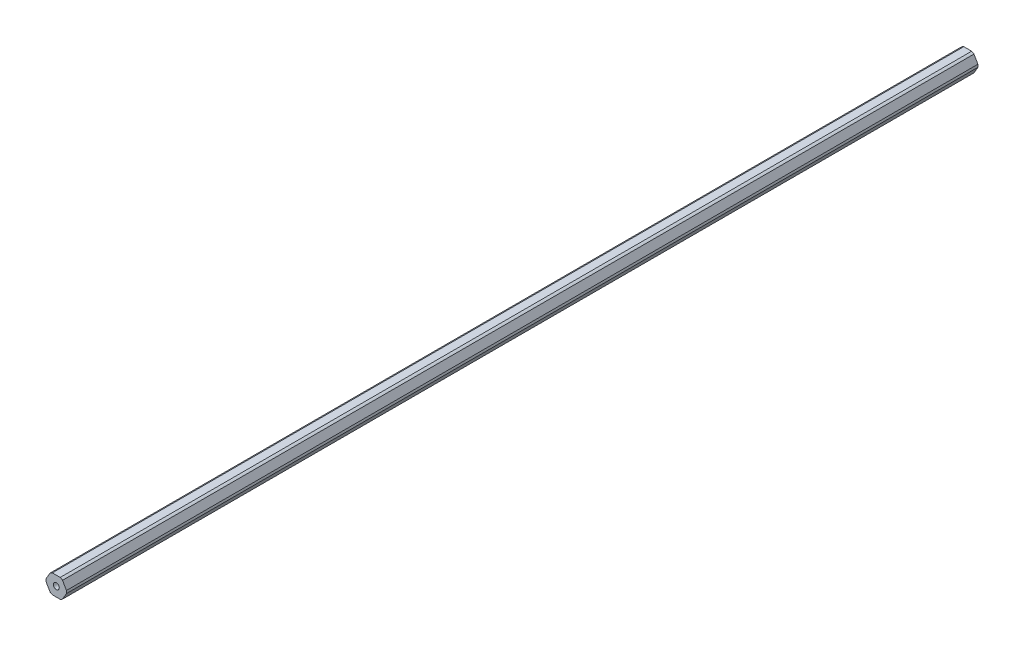
ISO-10303-21;
HEADER;
FILE_DESCRIPTION(('STEP AP214'),'2;1');
FILE_NAME('part.step','',(''),(''),'','','');
FILE_SCHEMA(('AUTOMOTIVE_DESIGN { 1 0 10303 214 1 1 1 1 }'));
ENDSEC;
DATA;
#1=APPLICATION_CONTEXT('core data for automotive mechanical design processes');
#2=APPLICATION_PROTOCOL_DEFINITION('international standard','automotive_design',2000,#1);
#3=PRODUCT_CONTEXT('',#1,'mechanical');
#4=PRODUCT('Part','Part','',(#3));
#5=PRODUCT_RELATED_PRODUCT_CATEGORY('part','',(#4));
#6=PRODUCT_DEFINITION_FORMATION('','',#4);
#7=PRODUCT_DEFINITION_CONTEXT('part definition',#1,'design');
#8=PRODUCT_DEFINITION('design','',#6,#7);
#9=PRODUCT_DEFINITION_SHAPE('','',#8);
#10=(LENGTH_UNIT() NAMED_UNIT(*) SI_UNIT(.MILLI.,.METRE.));
#11=(NAMED_UNIT(*) PLANE_ANGLE_UNIT() SI_UNIT($,.RADIAN.));
#12=(NAMED_UNIT(*) SI_UNIT($,.STERADIAN.) SOLID_ANGLE_UNIT());
#13=UNCERTAINTY_MEASURE_WITH_UNIT(LENGTH_MEASURE(1.E-05),#10,'distance_accuracy_value','');
#14=(GEOMETRIC_REPRESENTATION_CONTEXT(3) GLOBAL_UNCERTAINTY_ASSIGNED_CONTEXT((#13)) GLOBAL_UNIT_ASSIGNED_CONTEXT((#10,
#11,#12)) REPRESENTATION_CONTEXT('',''));
#15=CARTESIAN_POINT('',(0.,0.,0.));
#16=DIRECTION('',(0.,0.,1.));
#17=DIRECTION('',(1.,0.,0.));
#18=AXIS2_PLACEMENT_3D('',#15,#16,#17);
#19=CARTESIAN_POINT('',(5.49926131403119,3.175,609.6));
#20=DIRECTION('',(-0.866025403784439,-0.5,0.));
#21=DIRECTION('',(0.5,-0.866025403784438,0.));
#22=AXIS2_PLACEMENT_3D('',#19,#20,#21);
#23=PLANE('',#22);
#24=DIRECTION('',(-0.5,0.866025403784439,0.));
#25=VECTOR('',#24,1.);
#26=CARTESIAN_POINT('',(5.49926131403119,3.175,0.));
#27=LINE('',#26,#25);
#28=CARTESIAN_POINT('',(6.81675178197583,0.893039571032188,0.));
#29=VERTEX_POINT('',#28);
#30=CARTESIAN_POINT('',(4.18177084608655,5.45696042896782,0.));
#31=VERTEX_POINT('',#30);
#32=EDGE_CURVE('E166',#29,#31,#27,.T.);
#33=ORIENTED_EDGE('',*,*,#32,.T.);
#34=DIRECTION('',(0.,0.,-1.));
#35=VECTOR('',#34,1.);
#36=CARTESIAN_POINT('',(4.18177084608655,5.45696042896782,609.6));
#37=LINE('',#36,#35);
#38=CARTESIAN_POINT('',(4.18177084608655,5.45696042896782,609.6));
#39=VERTEX_POINT('',#38);
#40=EDGE_CURVE('E11',#39,#31,#37,.T.);
#41=ORIENTED_EDGE('',*,*,#40,.F.);
#42=DIRECTION('',(-0.5,0.866025403784439,0.));
#43=VECTOR('',#42,1.);
#44=CARTESIAN_POINT('',(5.49926131403119,3.175,609.6));
#45=LINE('',#44,#43);
#46=CARTESIAN_POINT('',(6.81675178197583,0.893039571032188,609.6));
#47=VERTEX_POINT('',#46);
#48=EDGE_CURVE('E225',#47,#39,#45,.T.);
#49=ORIENTED_EDGE('',*,*,#48,.F.);
#50=DIRECTION('',(0.,0.,-1.));
#51=VECTOR('',#50,1.);
#52=CARTESIAN_POINT('',(6.81675178197583,0.893039571032188,609.6));
#53=LINE('',#52,#51);
#54=EDGE_CURVE('E159',#47,#29,#53,.T.);
#55=ORIENTED_EDGE('',*,*,#54,.T.);
#56=EDGE_LOOP('',(#33,#41,#49,#55));
#57=FACE_BOUND('',#56,.T.);
#58=ADVANCED_FACE('F41',(#57),#23,.F.);
#59=CARTESIAN_POINT('',(0.,0.,609.6));
#60=DIRECTION('',(0.,0.,-1.));
#61=DIRECTION('',(-1.,0.,0.));
#62=AXIS2_PLACEMENT_3D('',#59,#60,#61);
#63=CYLINDRICAL_SURFACE('',#62,6.874999966);
#64=CARTESIAN_POINT('',(0.,0.,0.));
#65=DIRECTION('',(0.,0.,1.));
#66=DIRECTION('',(1.,0.,0.));
#67=AXIS2_PLACEMENT_3D('',#64,#65,#66);
#68=CIRCLE('',#67,6.874999966);
#69=CARTESIAN_POINT('',(2.63498093588928,6.35,0.));
#70=VERTEX_POINT('',#69);
#71=EDGE_CURVE('E169',#31,#70,#68,.T.);
#72=ORIENTED_EDGE('',*,*,#71,.T.);
#73=DIRECTION('',(0.,0.,-1.));
#74=VECTOR('',#73,1.);
#75=CARTESIAN_POINT('',(2.63498093588928,6.35,609.6));
#76=LINE('',#75,#74);
#77=CARTESIAN_POINT('',(2.63498093588928,6.35,609.6));
#78=VERTEX_POINT('',#77);
#79=EDGE_CURVE('E50',#78,#70,#76,.T.);
#80=ORIENTED_EDGE('',*,*,#79,.F.);
#81=CARTESIAN_POINT('',(0.,0.,609.6));
#82=DIRECTION('',(0.,0.,1.));
#83=DIRECTION('',(1.,0.,0.));
#84=AXIS2_PLACEMENT_3D('',#81,#82,#83);
#85=CIRCLE('',#84,6.874999966);
#86=EDGE_CURVE('E113',#39,#78,#85,.T.);
#87=ORIENTED_EDGE('',*,*,#86,.F.);
#88=ORIENTED_EDGE('',*,*,#40,.T.);
#89=EDGE_LOOP('',(#72,#80,#87,#88));
#90=FACE_BOUND('',#89,.T.);
#91=ADVANCED_FACE('F260',(#90),#63,.T.);
#92=CARTESIAN_POINT('',(0.,6.35,609.6));
#93=DIRECTION('',(0.,-1.,0.));
#94=DIRECTION('',(1.,0.,0.));
#95=AXIS2_PLACEMENT_3D('',#92,#93,#94);
#96=PLANE('',#95);
#97=DIRECTION('',(-1.,0.,0.));
#98=VECTOR('',#97,1.);
#99=CARTESIAN_POINT('',(0.,6.35,0.));
#100=LINE('',#99,#98);
#101=CARTESIAN_POINT('',(-2.63498093588928,6.35,0.));
#102=VERTEX_POINT('',#101);
#103=EDGE_CURVE('E171',#70,#102,#100,.T.);
#104=ORIENTED_EDGE('',*,*,#103,.T.);
#105=DIRECTION('',(0.,0.,-1.));
#106=VECTOR('',#105,1.);
#107=CARTESIAN_POINT('',(-2.63498093588928,6.35,609.6));
#108=LINE('',#107,#106);
#109=CARTESIAN_POINT('',(-2.63498093588928,6.35,609.6));
#110=VERTEX_POINT('',#109);
#111=EDGE_CURVE('E201',#110,#102,#108,.T.);
#112=ORIENTED_EDGE('',*,*,#111,.F.);
#113=DIRECTION('',(-1.,0.,0.));
#114=VECTOR('',#113,1.);
#115=CARTESIAN_POINT('',(0.,6.35,609.6));
#116=LINE('',#115,#114);
#117=EDGE_CURVE('E209',#78,#110,#116,.T.);
#118=ORIENTED_EDGE('',*,*,#117,.F.);
#119=ORIENTED_EDGE('',*,*,#79,.T.);
#120=EDGE_LOOP('',(#104,#112,#118,#119));
#121=FACE_BOUND('',#120,.T.);
#122=ADVANCED_FACE('F207',(#121),#96,.F.);
#123=CARTESIAN_POINT('',(-4.18177084608655,5.45696042896781,0.));
#124=VERTEX_POINT('',#123);
#125=EDGE_CURVE('E172',#102,#124,#68,.T.);
#126=ORIENTED_EDGE('',*,*,#125,.T.);
#127=DIRECTION('',(0.,0.,-1.));
#128=VECTOR('',#127,1.);
#129=CARTESIAN_POINT('',(-4.18177084608655,5.45696042896781,609.6));
#130=LINE('',#129,#128);
#131=CARTESIAN_POINT('',(-4.18177084608655,5.45696042896781,609.6));
#132=VERTEX_POINT('',#131);
#133=EDGE_CURVE('E198',#132,#124,#130,.T.);
#134=ORIENTED_EDGE('',*,*,#133,.F.);
#135=EDGE_CURVE('E231',#110,#132,#85,.T.);
#136=ORIENTED_EDGE('',*,*,#135,.F.);
#137=ORIENTED_EDGE('',*,*,#111,.T.);
#138=EDGE_LOOP('',(#126,#134,#136,#137));
#139=FACE_BOUND('',#138,.T.);
#140=ADVANCED_FACE('F242',(#139),#63,.T.);
#141=CARTESIAN_POINT('',(-5.49926131403119,3.175,609.6));
#142=DIRECTION('',(0.866025403784439,-0.5,0.));
#143=DIRECTION('',(0.5,0.866025403784439,0.));
#144=AXIS2_PLACEMENT_3D('',#141,#142,#143);
#145=PLANE('',#144);
#146=DIRECTION('',(-0.5,-0.866025403784439,0.));
#147=VECTOR('',#146,1.);
#148=CARTESIAN_POINT('',(-5.49926131403119,3.175,0.));
#149=LINE('',#148,#147);
#150=CARTESIAN_POINT('',(-6.81675178197583,0.893039571032188,0.));
#151=VERTEX_POINT('',#150);
#152=EDGE_CURVE('E174',#124,#151,#149,.T.);
#153=ORIENTED_EDGE('',*,*,#152,.T.);
#154=DIRECTION('',(0.,0.,-1.));
#155=VECTOR('',#154,1.);
#156=CARTESIAN_POINT('',(-6.81675178197583,0.893039571032188,609.6));
#157=LINE('',#156,#155);
#158=CARTESIAN_POINT('',(-6.81675178197583,0.893039571032188,609.6));
#159=VERTEX_POINT('',#158);
#160=EDGE_CURVE('E195',#159,#151,#157,.T.);
#161=ORIENTED_EDGE('',*,*,#160,.F.);
#162=DIRECTION('',(-0.5,-0.866025403784439,0.));
#163=VECTOR('',#162,1.);
#164=CARTESIAN_POINT('',(-5.49926131403119,3.175,609.6));
#165=LINE('',#164,#163);
#166=EDGE_CURVE('E233',#132,#159,#165,.T.);
#167=ORIENTED_EDGE('',*,*,#166,.F.);
#168=ORIENTED_EDGE('',*,*,#133,.T.);
#169=EDGE_LOOP('',(#153,#161,#167,#168));
#170=FACE_BOUND('',#169,.T.);
#171=ADVANCED_FACE('F244',(#170),#145,.F.);
#172=CARTESIAN_POINT('',(-6.81675178197583,-0.893039571032191,0.));
#173=VERTEX_POINT('',#172);
#174=EDGE_CURVE('E176',#151,#173,#68,.T.);
#175=ORIENTED_EDGE('',*,*,#174,.T.);
#176=DIRECTION('',(0.,0.,-1.));
#177=VECTOR('',#176,1.);
#178=CARTESIAN_POINT('',(-6.81675178197583,-0.893039571032191,609.6));
#179=LINE('',#178,#177);
#180=CARTESIAN_POINT('',(-6.81675178197583,-0.893039571032191,609.6));
#181=VERTEX_POINT('',#180);
#182=EDGE_CURVE('E192',#181,#173,#179,.T.);
#183=ORIENTED_EDGE('',*,*,#182,.F.);
#184=EDGE_CURVE('E234',#159,#181,#85,.T.);
#185=ORIENTED_EDGE('',*,*,#184,.F.);
#186=ORIENTED_EDGE('',*,*,#160,.T.);
#187=EDGE_LOOP('',(#175,#183,#185,#186));
#188=FACE_BOUND('',#187,.T.);
#189=ADVANCED_FACE('F245',(#188),#63,.T.);
#190=CARTESIAN_POINT('',(-5.49926131403119,-3.175,609.6));
#191=DIRECTION('',(0.866025403784439,0.5,0.));
#192=DIRECTION('',(-0.5,0.866025403784438,0.));
#193=AXIS2_PLACEMENT_3D('',#190,#191,#192);
#194=PLANE('',#193);
#195=DIRECTION('',(0.5,-0.866025403784439,0.));
#196=VECTOR('',#195,1.);
#197=CARTESIAN_POINT('',(-5.49926131403119,-3.175,0.));
#198=LINE('',#197,#196);
#199=CARTESIAN_POINT('',(-4.18177084608655,-5.45696042896782,0.));
#200=VERTEX_POINT('',#199);
#201=EDGE_CURVE('E177',#173,#200,#198,.T.);
#202=ORIENTED_EDGE('',*,*,#201,.T.);
#203=DIRECTION('',(0.,0.,-1.));
#204=VECTOR('',#203,1.);
#205=CARTESIAN_POINT('',(-4.18177084608655,-5.45696042896782,609.6));
#206=LINE('',#205,#204);
#207=CARTESIAN_POINT('',(-4.18177084608655,-5.45696042896782,609.6));
#208=VERTEX_POINT('',#207);
#209=EDGE_CURVE('E189',#208,#200,#206,.T.);
#210=ORIENTED_EDGE('',*,*,#209,.F.);
#211=DIRECTION('',(0.5,-0.866025403784439,0.));
#212=VECTOR('',#211,1.);
#213=CARTESIAN_POINT('',(-5.49926131403119,-3.175,609.6));
#214=LINE('',#213,#212);
#215=EDGE_CURVE('E235',#181,#208,#214,.T.);
#216=ORIENTED_EDGE('',*,*,#215,.F.);
#217=ORIENTED_EDGE('',*,*,#182,.T.);
#218=EDGE_LOOP('',(#202,#210,#216,#217));
#219=FACE_BOUND('',#218,.T.);
#220=ADVANCED_FACE('F248',(#219),#194,.F.);
#221=CARTESIAN_POINT('',(-2.63498093588928,-6.35,0.));
#222=VERTEX_POINT('',#221);
#223=EDGE_CURVE('E179',#200,#222,#68,.T.);
#224=ORIENTED_EDGE('',*,*,#223,.T.);
#225=DIRECTION('',(0.,0.,-1.));
#226=VECTOR('',#225,1.);
#227=CARTESIAN_POINT('',(-2.63498093588928,-6.35,609.6));
#228=LINE('',#227,#226);
#229=CARTESIAN_POINT('',(-2.63498093588928,-6.35,609.6));
#230=VERTEX_POINT('',#229);
#231=EDGE_CURVE('E186',#230,#222,#228,.T.);
#232=ORIENTED_EDGE('',*,*,#231,.F.);
#233=EDGE_CURVE('E149',#208,#230,#85,.T.);
#234=ORIENTED_EDGE('',*,*,#233,.F.);
#235=ORIENTED_EDGE('',*,*,#209,.T.);
#236=EDGE_LOOP('',(#224,#232,#234,#235));
#237=FACE_BOUND('',#236,.T.);
#238=ADVANCED_FACE('F250',(#237),#63,.T.);
#239=CARTESIAN_POINT('',(0.,-6.35,609.6));
#240=DIRECTION('',(0.,1.,0.));
#241=DIRECTION('',(0.,0.,1.));
#242=AXIS2_PLACEMENT_3D('',#239,#240,#241);
#243=PLANE('',#242);
#244=DIRECTION('',(1.,0.,0.));
#245=VECTOR('',#244,1.);
#246=CARTESIAN_POINT('',(0.,-6.35,0.));
#247=LINE('',#246,#245);
#248=CARTESIAN_POINT('',(2.63498093588928,-6.35,0.));
#249=VERTEX_POINT('',#248);
#250=EDGE_CURVE('E180',#222,#249,#247,.T.);
#251=ORIENTED_EDGE('',*,*,#250,.T.);
#252=DIRECTION('',(0.,0.,-1.));
#253=VECTOR('',#252,1.);
#254=CARTESIAN_POINT('',(2.63498093588928,-6.35,609.6));
#255=LINE('',#254,#253);
#256=CARTESIAN_POINT('',(2.63498093588928,-6.35,609.6));
#257=VERTEX_POINT('',#256);
#258=EDGE_CURVE('E154',#257,#249,#255,.T.);
#259=ORIENTED_EDGE('',*,*,#258,.F.);
#260=DIRECTION('',(1.,0.,0.));
#261=VECTOR('',#260,1.);
#262=CARTESIAN_POINT('',(0.,-6.35,609.6));
#263=LINE('',#262,#261);
#264=EDGE_CURVE('E144',#230,#257,#263,.T.);
#265=ORIENTED_EDGE('',*,*,#264,.F.);
#266=ORIENTED_EDGE('',*,*,#231,.T.);
#267=EDGE_LOOP('',(#251,#259,#265,#266));
#268=FACE_BOUND('',#267,.T.);
#269=ADVANCED_FACE('F253',(#268),#243,.F.);
#270=CARTESIAN_POINT('',(4.18177084608655,-5.45696042896781,0.));
#271=VERTEX_POINT('',#270);
#272=EDGE_CURVE('E153',#249,#271,#68,.T.);
#273=ORIENTED_EDGE('',*,*,#272,.T.);
#274=DIRECTION('',(0.,0.,-1.));
#275=VECTOR('',#274,1.);
#276=CARTESIAN_POINT('',(4.18177084608655,-5.45696042896781,609.6));
#277=LINE('',#276,#275);
#278=CARTESIAN_POINT('',(4.18177084608655,-5.45696042896781,609.6));
#279=VERTEX_POINT('',#278);
#280=EDGE_CURVE('E150',#279,#271,#277,.T.);
#281=ORIENTED_EDGE('',*,*,#280,.F.);
#282=EDGE_CURVE('E138',#257,#279,#85,.T.);
#283=ORIENTED_EDGE('',*,*,#282,.F.);
#284=ORIENTED_EDGE('',*,*,#258,.T.);
#285=EDGE_LOOP('',(#273,#281,#283,#284));
#286=FACE_BOUND('',#285,.T.);
#287=ADVANCED_FACE('F151',(#286),#63,.T.);
#288=CARTESIAN_POINT('',(5.49926131403119,-3.175,609.6));
#289=DIRECTION('',(-0.866025403784439,0.5,0.));
#290=DIRECTION('',(-0.5,-0.866025403784439,0.));
#291=AXIS2_PLACEMENT_3D('',#288,#289,#290);
#292=PLANE('',#291);
#293=DIRECTION('',(0.5,0.866025403784439,0.));
#294=VECTOR('',#293,1.);
#295=CARTESIAN_POINT('',(5.49926131403119,-3.175,0.));
#296=LINE('',#295,#294);
#297=CARTESIAN_POINT('',(6.81675178197583,-0.893039571032188,0.));
#298=VERTEX_POINT('',#297);
#299=EDGE_CURVE('E99',#271,#298,#296,.T.);
#300=ORIENTED_EDGE('',*,*,#299,.T.);
#301=DIRECTION('',(0.,0.,-1.));
#302=VECTOR('',#301,1.);
#303=CARTESIAN_POINT('',(6.81675178197583,-0.893039571032188,609.6));
#304=LINE('',#303,#302);
#305=CARTESIAN_POINT('',(6.81675178197583,-0.893039571032188,609.6));
#306=VERTEX_POINT('',#305);
#307=EDGE_CURVE('E155',#306,#298,#304,.T.);
#308=ORIENTED_EDGE('',*,*,#307,.F.);
#309=DIRECTION('',(0.5,0.866025403784439,0.));
#310=VECTOR('',#309,1.);
#311=CARTESIAN_POINT('',(5.49926131403119,-3.175,609.6));
#312=LINE('',#311,#310);
#313=EDGE_CURVE('E142',#279,#306,#312,.T.);
#314=ORIENTED_EDGE('',*,*,#313,.F.);
#315=ORIENTED_EDGE('',*,*,#280,.T.);
#316=EDGE_LOOP('',(#300,#308,#314,#315));
#317=FACE_BOUND('',#316,.T.);
#318=ADVANCED_FACE('F157',(#317),#292,.F.);
#319=CARTESIAN_POINT('',(0.,0.,609.6));
#320=DIRECTION('',(0.,0.,-1.));
#321=DIRECTION('',(-1.,0.,0.));
#322=AXIS2_PLACEMENT_3D('',#319,#320,#321);
#323=CYLINDRICAL_SURFACE('',#322,2.000000064);
#324=CARTESIAN_POINT('',(0.,0.,609.6));
#325=DIRECTION('',(0.,0.,1.));
#326=DIRECTION('',(1.,0.,0.));
#327=AXIS2_PLACEMENT_3D('',#324,#325,#326);
#328=CIRCLE('',#327,2.000000064);
#329=CARTESIAN_POINT('',(-2.000000064,0.,609.6));
#330=VERTEX_POINT('',#329);
#331=EDGE_CURVE('E223',#330,#330,#328,.T.);
#332=CARTESIAN_POINT('',(0.,0.,0.));
#333=DIRECTION('',(0.,0.,1.));
#334=DIRECTION('',(1.,0.,0.));
#335=AXIS2_PLACEMENT_3D('',#332,#333,#334);
#336=CIRCLE('',#335,2.000000064);
#337=CARTESIAN_POINT('',(-2.000000064,0.,0.));
#338=VERTEX_POINT('',#337);
#339=EDGE_CURVE('E163',#338,#338,#336,.T.);
#340=CARTESIAN_POINT('',(-2.000000064,0.,609.6));
#341=CARTESIAN_POINT('',(-2.000000064,0.,603.25));
#342=CARTESIAN_POINT('',(-2.000000064,0.,596.9));
#343=CARTESIAN_POINT('',(-2.000000064,0.,584.2));
#344=CARTESIAN_POINT('',(-2.000000064,0.,577.85));
#345=CARTESIAN_POINT('',(-2.000000064,0.,565.15));
#346=CARTESIAN_POINT('',(-2.000000064,0.,558.8));
#347=CARTESIAN_POINT('',(-2.000000064,0.,546.1));
#348=CARTESIAN_POINT('',(-2.000000064,0.,539.75));
#349=CARTESIAN_POINT('',(-2.000000064,0.,527.05));
#350=CARTESIAN_POINT('',(-2.000000064,0.,520.7));
#351=CARTESIAN_POINT('',(-2.000000064,0.,508.));
#352=CARTESIAN_POINT('',(-2.000000064,0.,501.65));
#353=CARTESIAN_POINT('',(-2.000000064,0.,488.95));
#354=CARTESIAN_POINT('',(-2.000000064,0.,482.6));
#355=CARTESIAN_POINT('',(-2.000000064,0.,469.9));
#356=CARTESIAN_POINT('',(-2.000000064,0.,463.55));
#357=CARTESIAN_POINT('',(-2.000000064,0.,450.85));
#358=CARTESIAN_POINT('',(-2.000000064,0.,444.5));
#359=CARTESIAN_POINT('',(-2.000000064,0.,431.8));
#360=CARTESIAN_POINT('',(-2.000000064,0.,425.45));
#361=CARTESIAN_POINT('',(-2.000000064,0.,412.75));
#362=CARTESIAN_POINT('',(-2.000000064,0.,406.4));
#363=CARTESIAN_POINT('',(-2.000000064,0.,393.7));
#364=CARTESIAN_POINT('',(-2.000000064,0.,387.35));
#365=CARTESIAN_POINT('',(-2.000000064,0.,374.65));
#366=CARTESIAN_POINT('',(-2.000000064,0.,368.3));
#367=CARTESIAN_POINT('',(-2.000000064,0.,355.6));
#368=CARTESIAN_POINT('',(-2.000000064,0.,349.25));
#369=CARTESIAN_POINT('',(-2.000000064,0.,336.55));
#370=CARTESIAN_POINT('',(-2.000000064,0.,330.2));
#371=CARTESIAN_POINT('',(-2.000000064,0.,317.5));
#372=CARTESIAN_POINT('',(-2.000000064,0.,311.15));
#373=CARTESIAN_POINT('',(-2.000000064,0.,298.45));
#374=CARTESIAN_POINT('',(-2.000000064,0.,292.1));
#375=CARTESIAN_POINT('',(-2.000000064,0.,279.4));
#376=CARTESIAN_POINT('',(-2.000000064,0.,273.05));
#377=CARTESIAN_POINT('',(-2.000000064,0.,260.35));
#378=CARTESIAN_POINT('',(-2.000000064,0.,254.));
#379=CARTESIAN_POINT('',(-2.000000064,0.,241.3));
#380=CARTESIAN_POINT('',(-2.000000064,0.,234.95));
#381=CARTESIAN_POINT('',(-2.000000064,0.,222.25));
#382=CARTESIAN_POINT('',(-2.000000064,0.,215.9));
#383=CARTESIAN_POINT('',(-2.000000064,0.,203.2));
#384=CARTESIAN_POINT('',(-2.000000064,0.,196.85));
#385=CARTESIAN_POINT('',(-2.000000064,0.,184.15));
#386=CARTESIAN_POINT('',(-2.000000064,0.,177.8));
#387=CARTESIAN_POINT('',(-2.000000064,0.,165.1));
#388=CARTESIAN_POINT('',(-2.000000064,0.,158.75));
#389=CARTESIAN_POINT('',(-2.000000064,0.,146.05));
#390=CARTESIAN_POINT('',(-2.000000064,0.,139.7));
#391=CARTESIAN_POINT('',(-2.000000064,0.,127.));
#392=CARTESIAN_POINT('',(-2.000000064,0.,120.65));
#393=CARTESIAN_POINT('',(-2.000000064,0.,107.95));
#394=CARTESIAN_POINT('',(-2.000000064,0.,101.6));
#395=CARTESIAN_POINT('',(-2.000000064,0.,88.9));
#396=CARTESIAN_POINT('',(-2.000000064,0.,82.5500000000001));
#397=CARTESIAN_POINT('',(-2.000000064,0.,69.85));
#398=CARTESIAN_POINT('',(-2.000000064,0.,63.5));
#399=CARTESIAN_POINT('',(-2.000000064,0.,50.8));
#400=CARTESIAN_POINT('',(-2.000000064,0.,44.45));
#401=CARTESIAN_POINT('',(-2.000000064,0.,31.75));
#402=CARTESIAN_POINT('',(-2.000000064,0.,25.4));
#403=CARTESIAN_POINT('',(-2.000000064,0.,12.7));
#404=CARTESIAN_POINT('',(-2.000000064,0.,6.35000000000001));
#405=CARTESIAN_POINT('',(-2.000000064,0.,0.));
#406=B_SPLINE_CURVE_WITH_KNOTS('',3,(#340,#341,#342,#343,#344,#345,#346,#347,#348,#349,#350,
#351,#352,#353,#354,#355,#356,#357,#358,#359,#360,#361,#362,#363,#364,#365,#366,#367,#368,#369,
#370,#371,#372,#373,#374,#375,#376,#377,#378,#379,#380,#381,#382,#383,#384,#385,#386,#387,#388,
#389,#390,#391,#392,#393,#394,#395,#396,#397,#398,#399,#400,#401,#402,#403,#404,#405),
.UNSPECIFIED.,.F.,.F.,(4,2,2,2,2,2,2,2,2,2,2,2,2,2,2,2,2,2,2,2,2,2,2,2,2,2,2,2,2,2,2,2,4),(0.,
19.0499999999999,38.0999999999999,57.1499999999999,76.1999999999999,95.2499999999999,114.3,
133.35,152.4,171.45,190.5,209.55,228.6,247.65,266.7,285.75,304.8,323.85,342.9,361.95,381.,
400.05,419.1,438.15,457.2,476.25,495.3,514.35,533.4,552.45,571.5,590.55,609.6),.UNSPECIFIED.);
#407=EDGE_CURVE('BSEAM43',#330,#338,#406,.T.);
#408=ORIENTED_EDGE('',*,*,#331,.T.);
#409=ORIENTED_EDGE('',*,*,#339,.F.);
#410=ORIENTED_EDGE('',*,*,#407,.T.);
#411=ORIENTED_EDGE('',*,*,#407,.F.);
#412=EDGE_LOOP('',(#408,#410,#409,#411));
#413=FACE_BOUND('',#412,.T.);
#414=ADVANCED_FACE('F43',(#413),#323,.F.);
#415=EDGE_CURVE('E105',#298,#29,#68,.T.);
#416=ORIENTED_EDGE('',*,*,#415,.T.);
#417=ORIENTED_EDGE('',*,*,#54,.F.);
#418=EDGE_CURVE('E58',#306,#47,#85,.T.);
#419=ORIENTED_EDGE('',*,*,#418,.F.);
#420=ORIENTED_EDGE('',*,*,#307,.T.);
#421=EDGE_LOOP('',(#416,#417,#419,#420));
#422=FACE_BOUND('',#421,.T.);
#423=ADVANCED_FACE('F257',(#422),#63,.T.);
#424=CARTESIAN_POINT('',(0.,0.,609.6));
#425=DIRECTION('',(0.,0.,1.));
#426=DIRECTION('',(1.,0.,0.));
#427=AXIS2_PLACEMENT_3D('',#424,#425,#426);
#428=PLANE('',#427);
#429=ORIENTED_EDGE('',*,*,#331,.F.);
#430=EDGE_LOOP('',(#429));
#431=FACE_BOUND('',#430,.T.);
#432=ORIENTED_EDGE('',*,*,#48,.T.);
#433=ORIENTED_EDGE('',*,*,#86,.T.);
#434=ORIENTED_EDGE('',*,*,#117,.T.);
#435=ORIENTED_EDGE('',*,*,#135,.T.);
#436=ORIENTED_EDGE('',*,*,#166,.T.);
#437=ORIENTED_EDGE('',*,*,#184,.T.);
#438=ORIENTED_EDGE('',*,*,#215,.T.);
#439=ORIENTED_EDGE('',*,*,#233,.T.);
#440=ORIENTED_EDGE('',*,*,#264,.T.);
#441=ORIENTED_EDGE('',*,*,#282,.T.);
#442=ORIENTED_EDGE('',*,*,#313,.T.);
#443=ORIENTED_EDGE('',*,*,#418,.T.);
#444=EDGE_LOOP('',(#432,#433,#434,#435,#436,#437,#438,#439,#440,#441,#442,#443));
#445=FACE_BOUND('',#444,.T.);
#446=ADVANCED_FACE('F140',(#431,#445),#428,.T.);
#447=CARTESIAN_POINT('',(0.,0.,0.));
#448=DIRECTION('',(0.,0.,1.));
#449=DIRECTION('',(1.,0.,0.));
#450=AXIS2_PLACEMENT_3D('',#447,#448,#449);
#451=PLANE('',#450);
#452=ORIENTED_EDGE('',*,*,#339,.T.);
#453=EDGE_LOOP('',(#452));
#454=FACE_BOUND('',#453,.T.);
#455=ORIENTED_EDGE('',*,*,#32,.F.);
#456=ORIENTED_EDGE('',*,*,#415,.F.);
#457=ORIENTED_EDGE('',*,*,#299,.F.);
#458=ORIENTED_EDGE('',*,*,#272,.F.);
#459=ORIENTED_EDGE('',*,*,#250,.F.);
#460=ORIENTED_EDGE('',*,*,#223,.F.);
#461=ORIENTED_EDGE('',*,*,#201,.F.);
#462=ORIENTED_EDGE('',*,*,#174,.F.);
#463=ORIENTED_EDGE('',*,*,#152,.F.);
#464=ORIENTED_EDGE('',*,*,#125,.F.);
#465=ORIENTED_EDGE('',*,*,#103,.F.);
#466=ORIENTED_EDGE('',*,*,#71,.F.);
#467=EDGE_LOOP('',(#455,#456,#457,#458,#459,#460,#461,#462,#463,#464,#465,#466));
#468=FACE_BOUND('',#467,.T.);
#469=ADVANCED_FACE('F213',(#454,#468),#451,.F.);
#470=CLOSED_SHELL('',(#58,#91,#122,#140,#171,#189,#220,#238,#269,#287,#318,#414,#423,#446,#469));
#471=MANIFOLD_SOLID_BREP('B2',#470);
#472=ADVANCED_BREP_SHAPE_REPRESENTATION('',(#18,#471),#14);
#473=SHAPE_DEFINITION_REPRESENTATION(#9,#472);
ENDSEC;
END-ISO-10303-21;
